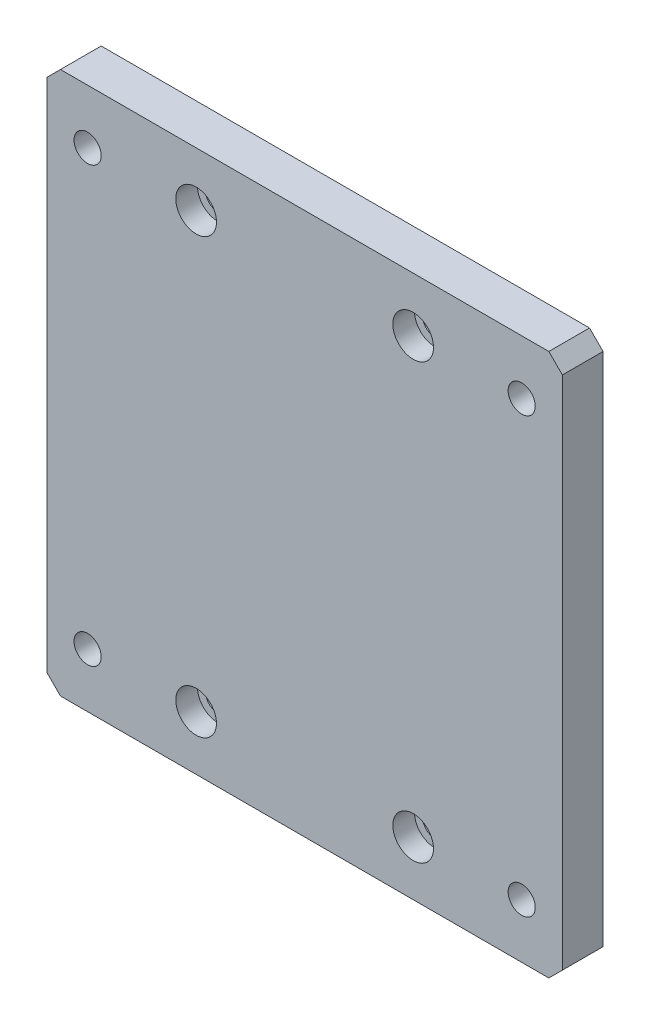
ISO-10303-21;
HEADER;
FILE_DESCRIPTION(('STEP AP214'),'2;1');
FILE_NAME('part.step','',(''),(''),'','','');
FILE_SCHEMA(('AUTOMOTIVE_DESIGN { 1 0 10303 214 1 1 1 1 }'));
ENDSEC;
DATA;
#1=APPLICATION_CONTEXT('core data for automotive mechanical design processes');
#2=APPLICATION_PROTOCOL_DEFINITION('international standard','automotive_design',2000,#1);
#3=PRODUCT_CONTEXT('',#1,'mechanical');
#4=PRODUCT('Part','Part','',(#3));
#5=PRODUCT_RELATED_PRODUCT_CATEGORY('part','',(#4));
#6=PRODUCT_DEFINITION_FORMATION('','',#4);
#7=PRODUCT_DEFINITION_CONTEXT('part definition',#1,'design');
#8=PRODUCT_DEFINITION('design','',#6,#7);
#9=PRODUCT_DEFINITION_SHAPE('','',#8);
#10=(LENGTH_UNIT() NAMED_UNIT(*) SI_UNIT(.MILLI.,.METRE.));
#11=(NAMED_UNIT(*) PLANE_ANGLE_UNIT() SI_UNIT($,.RADIAN.));
#12=(NAMED_UNIT(*) SI_UNIT($,.STERADIAN.) SOLID_ANGLE_UNIT());
#13=UNCERTAINTY_MEASURE_WITH_UNIT(LENGTH_MEASURE(1.E-05),#10,'distance_accuracy_value','');
#14=(GEOMETRIC_REPRESENTATION_CONTEXT(3) GLOBAL_UNCERTAINTY_ASSIGNED_CONTEXT((#13)) GLOBAL_UNIT_ASSIGNED_CONTEXT((#10,
#11,#12)) REPRESENTATION_CONTEXT('',''));
#15=CARTESIAN_POINT('',(0.,0.,0.));
#16=DIRECTION('',(0.,0.,1.));
#17=DIRECTION('',(1.,0.,0.));
#18=AXIS2_PLACEMENT_3D('',#15,#16,#17);
#19=CARTESIAN_POINT('',(95.,100.,15.));
#20=DIRECTION('',(-1.,0.,0.));
#21=DIRECTION('',(0.,-1.,0.));
#22=AXIS2_PLACEMENT_3D('',#19,#20,#21);
#23=PLANE('',#22);
#24=DIRECTION('',(0.,1.,0.));
#25=VECTOR('',#24,1.);
#26=CARTESIAN_POINT('',(95.,100.,0.));
#27=LINE('',#26,#25);
#28=CARTESIAN_POINT('',(95.,-95.,0.));
#29=VERTEX_POINT('',#28);
#30=CARTESIAN_POINT('',(95.,95.,0.));
#31=VERTEX_POINT('',#30);
#32=EDGE_CURVE('E127',#29,#31,#27,.T.);
#33=ORIENTED_EDGE('',*,*,#32,.T.);
#34=DIRECTION('',(0.,0.,1.));
#35=VECTOR('',#34,1.);
#36=CARTESIAN_POINT('',(95.,95.,15.));
#37=LINE('',#36,#35);
#38=CARTESIAN_POINT('',(95.,95.,15.));
#39=VERTEX_POINT('',#38);
#40=EDGE_CURVE('E104',#31,#39,#37,.T.);
#41=ORIENTED_EDGE('',*,*,#40,.T.);
#42=DIRECTION('',(0.,1.,0.));
#43=VECTOR('',#42,1.);
#44=CARTESIAN_POINT('',(95.,100.,15.));
#45=LINE('',#44,#43);
#46=CARTESIAN_POINT('',(95.,-95.,15.));
#47=VERTEX_POINT('',#46);
#48=EDGE_CURVE('E137',#47,#39,#45,.T.);
#49=ORIENTED_EDGE('',*,*,#48,.F.);
#50=DIRECTION('',(0.,0.,-1.));
#51=VECTOR('',#50,1.);
#52=CARTESIAN_POINT('',(95.,-95.,15.));
#53=LINE('',#52,#51);
#54=EDGE_CURVE('E109',#47,#29,#53,.T.);
#55=ORIENTED_EDGE('',*,*,#54,.T.);
#56=EDGE_LOOP('',(#33,#41,#49,#55));
#57=FACE_BOUND('',#56,.T.);
#58=ADVANCED_FACE('F32',(#57),#23,.F.);
#59=CARTESIAN_POINT('',(-95.,100.,15.));
#60=DIRECTION('',(0.,-1.,0.));
#61=DIRECTION('',(0.,0.,-1.));
#62=AXIS2_PLACEMENT_3D('',#59,#60,#61);
#63=PLANE('',#62);
#64=DIRECTION('',(-1.,0.,0.));
#65=VECTOR('',#64,1.);
#66=CARTESIAN_POINT('',(-95.,100.,15.));
#67=LINE('',#66,#65);
#68=CARTESIAN_POINT('',(90.,100.,15.));
#69=VERTEX_POINT('',#68);
#70=CARTESIAN_POINT('',(-90.,100.,15.));
#71=VERTEX_POINT('',#70);
#72=EDGE_CURVE('E119',#69,#71,#67,.T.);
#73=ORIENTED_EDGE('',*,*,#72,.F.);
#74=DIRECTION('',(0.,0.,-1.));
#75=VECTOR('',#74,1.);
#76=CARTESIAN_POINT('',(90.,100.,15.));
#77=LINE('',#76,#75);
#78=CARTESIAN_POINT('',(90.,100.,0.));
#79=VERTEX_POINT('',#78);
#80=EDGE_CURVE('E103',#69,#79,#77,.T.);
#81=ORIENTED_EDGE('',*,*,#80,.T.);
#82=DIRECTION('',(-1.,0.,0.));
#83=VECTOR('',#82,1.);
#84=CARTESIAN_POINT('',(-95.,100.,0.));
#85=LINE('',#84,#83);
#86=CARTESIAN_POINT('',(-90.,100.,0.));
#87=VERTEX_POINT('',#86);
#88=EDGE_CURVE('E116',#79,#87,#85,.T.);
#89=ORIENTED_EDGE('',*,*,#88,.T.);
#90=DIRECTION('',(0.,0.,1.));
#91=VECTOR('',#90,1.);
#92=CARTESIAN_POINT('',(-90.,100.,15.));
#93=LINE('',#92,#91);
#94=EDGE_CURVE('E121',#87,#71,#93,.T.);
#95=ORIENTED_EDGE('',*,*,#94,.T.);
#96=EDGE_LOOP('',(#73,#81,#89,#95));
#97=FACE_BOUND('',#96,.T.);
#98=ADVANCED_FACE('F115',(#97),#63,.F.);
#99=CARTESIAN_POINT('',(-95.,100.,15.));
#100=DIRECTION('',(1.,0.,0.));
#101=DIRECTION('',(0.,1.,0.));
#102=AXIS2_PLACEMENT_3D('',#99,#100,#101);
#103=PLANE('',#102);
#104=DIRECTION('',(0.,-1.,0.));
#105=VECTOR('',#104,1.);
#106=CARTESIAN_POINT('',(-95.,100.,15.));
#107=LINE('',#106,#105);
#108=CARTESIAN_POINT('',(-95.,95.,15.));
#109=VERTEX_POINT('',#108);
#110=CARTESIAN_POINT('',(-95.,-95.,15.));
#111=VERTEX_POINT('',#110);
#112=EDGE_CURVE('E160',#109,#111,#107,.T.);
#113=ORIENTED_EDGE('',*,*,#112,.F.);
#114=DIRECTION('',(0.,0.,-1.));
#115=VECTOR('',#114,1.);
#116=CARTESIAN_POINT('',(-95.,95.,15.));
#117=LINE('',#116,#115);
#118=CARTESIAN_POINT('',(-95.,95.,0.));
#119=VERTEX_POINT('',#118);
#120=EDGE_CURVE('E11',#109,#119,#117,.T.);
#121=ORIENTED_EDGE('',*,*,#120,.T.);
#122=DIRECTION('',(0.,-1.,0.));
#123=VECTOR('',#122,1.);
#124=CARTESIAN_POINT('',(-95.,100.,0.));
#125=LINE('',#124,#123);
#126=CARTESIAN_POINT('',(-95.,-95.,0.));
#127=VERTEX_POINT('',#126);
#128=EDGE_CURVE('E126',#119,#127,#125,.T.);
#129=ORIENTED_EDGE('',*,*,#128,.T.);
#130=DIRECTION('',(0.,0.,1.));
#131=VECTOR('',#130,1.);
#132=CARTESIAN_POINT('',(-95.,-95.,15.));
#133=LINE('',#132,#131);
#134=EDGE_CURVE('E40',#127,#111,#133,.T.);
#135=ORIENTED_EDGE('',*,*,#134,.T.);
#136=EDGE_LOOP('',(#113,#121,#129,#135));
#137=FACE_BOUND('',#136,.T.);
#138=ADVANCED_FACE('F159',(#137),#103,.F.);
#139=CARTESIAN_POINT('',(-95.,-100.,15.));
#140=DIRECTION('',(0.,1.,0.));
#141=DIRECTION('',(0.,0.,1.));
#142=AXIS2_PLACEMENT_3D('',#139,#140,#141);
#143=PLANE('',#142);
#144=DIRECTION('',(1.,0.,0.));
#145=VECTOR('',#144,1.);
#146=CARTESIAN_POINT('',(-95.,-100.,0.));
#147=LINE('',#146,#145);
#148=CARTESIAN_POINT('',(-90.,-100.,0.));
#149=VERTEX_POINT('',#148);
#150=CARTESIAN_POINT('',(90.,-100.,0.));
#151=VERTEX_POINT('',#150);
#152=EDGE_CURVE('E130',#149,#151,#147,.T.);
#153=ORIENTED_EDGE('',*,*,#152,.T.);
#154=DIRECTION('',(0.,0.,1.));
#155=VECTOR('',#154,1.);
#156=CARTESIAN_POINT('',(90.,-100.,15.));
#157=LINE('',#156,#155);
#158=CARTESIAN_POINT('',(90.,-100.,15.));
#159=VERTEX_POINT('',#158);
#160=EDGE_CURVE('E47',#151,#159,#157,.T.);
#161=ORIENTED_EDGE('',*,*,#160,.T.);
#162=DIRECTION('',(1.,0.,0.));
#163=VECTOR('',#162,1.);
#164=CARTESIAN_POINT('',(-95.,-100.,15.));
#165=LINE('',#164,#163);
#166=CARTESIAN_POINT('',(-90.,-100.,15.));
#167=VERTEX_POINT('',#166);
#168=EDGE_CURVE('E138',#167,#159,#165,.T.);
#169=ORIENTED_EDGE('',*,*,#168,.F.);
#170=DIRECTION('',(0.,0.,-1.));
#171=VECTOR('',#170,1.);
#172=CARTESIAN_POINT('',(-90.,-100.,15.));
#173=LINE('',#172,#171);
#174=EDGE_CURVE('E153',#167,#149,#173,.T.);
#175=ORIENTED_EDGE('',*,*,#174,.T.);
#176=EDGE_LOOP('',(#153,#161,#169,#175));
#177=FACE_BOUND('',#176,.T.);
#178=ADVANCED_FACE('F169',(#177),#143,.F.);
#179=CARTESIAN_POINT('',(0.,0.,15.));
#180=DIRECTION('',(0.,0.,1.));
#181=DIRECTION('',(1.,0.,0.));
#182=AXIS2_PLACEMENT_3D('',#179,#180,#181);
#183=PLANE('',#182);
#184=CARTESIAN_POINT('',(40.,80.,15.));
#185=DIRECTION('',(0.,0.,1.));
#186=DIRECTION('',(1.,0.,0.));
#187=AXIS2_PLACEMENT_3D('',#184,#185,#186);
#188=CIRCLE('',#187,7.5);
#189=CARTESIAN_POINT('',(47.5,80.,15.));
#190=VERTEX_POINT('',#189);
#191=EDGE_CURVE('E247',#190,#190,#188,.T.);
#192=ORIENTED_EDGE('',*,*,#191,.F.);
#193=EDGE_LOOP('',(#192));
#194=FACE_BOUND('',#193,.T.);
#195=CARTESIAN_POINT('',(-40.,80.,15.));
#196=DIRECTION('',(0.,0.,1.));
#197=DIRECTION('',(1.,0.,0.));
#198=AXIS2_PLACEMENT_3D('',#195,#196,#197);
#199=CIRCLE('',#198,7.5);
#200=CARTESIAN_POINT('',(-32.5,80.,15.));
#201=VERTEX_POINT('',#200);
#202=EDGE_CURVE('E235',#201,#201,#199,.T.);
#203=ORIENTED_EDGE('',*,*,#202,.F.);
#204=EDGE_LOOP('',(#203));
#205=FACE_BOUND('',#204,.T.);
#206=CARTESIAN_POINT('',(-40.,-80.,15.));
#207=DIRECTION('',(0.,0.,1.));
#208=DIRECTION('',(1.,0.,0.));
#209=AXIS2_PLACEMENT_3D('',#206,#207,#208);
#210=CIRCLE('',#209,7.5);
#211=CARTESIAN_POINT('',(-32.5,-80.,15.));
#212=VERTEX_POINT('',#211);
#213=EDGE_CURVE('E223',#212,#212,#210,.T.);
#214=ORIENTED_EDGE('',*,*,#213,.F.);
#215=EDGE_LOOP('',(#214));
#216=FACE_BOUND('',#215,.T.);
#217=CARTESIAN_POINT('',(40.,-80.,15.));
#218=DIRECTION('',(0.,0.,1.));
#219=DIRECTION('',(1.,0.,0.));
#220=AXIS2_PLACEMENT_3D('',#217,#218,#219);
#221=CIRCLE('',#220,7.5);
#222=CARTESIAN_POINT('',(47.5,-80.,15.));
#223=VERTEX_POINT('',#222);
#224=EDGE_CURVE('E211',#223,#223,#221,.T.);
#225=ORIENTED_EDGE('',*,*,#224,.F.);
#226=EDGE_LOOP('',(#225));
#227=FACE_BOUND('',#226,.T.);
#228=CARTESIAN_POINT('',(-80.,-80.,15.));
#229=DIRECTION('',(0.,0.,1.));
#230=DIRECTION('',(1.,0.,0.));
#231=AXIS2_PLACEMENT_3D('',#228,#229,#230);
#232=CIRCLE('',#231,5.00000000000001);
#233=CARTESIAN_POINT('',(-75.,-80.,15.));
#234=VERTEX_POINT('',#233);
#235=EDGE_CURVE('E185',#234,#234,#232,.T.);
#236=ORIENTED_EDGE('',*,*,#235,.F.);
#237=EDGE_LOOP('',(#236));
#238=FACE_BOUND('',#237,.T.);
#239=CARTESIAN_POINT('',(80.,-80.,15.));
#240=DIRECTION('',(0.,0.,1.));
#241=DIRECTION('',(1.,0.,0.));
#242=AXIS2_PLACEMENT_3D('',#239,#240,#241);
#243=CIRCLE('',#242,5.00000000000001);
#244=CARTESIAN_POINT('',(85.,-80.,15.));
#245=VERTEX_POINT('',#244);
#246=EDGE_CURVE('E192',#245,#245,#243,.T.);
#247=ORIENTED_EDGE('',*,*,#246,.F.);
#248=EDGE_LOOP('',(#247));
#249=FACE_BOUND('',#248,.T.);
#250=CARTESIAN_POINT('',(80.,80.,15.));
#251=DIRECTION('',(0.,0.,1.));
#252=DIRECTION('',(1.,0.,0.));
#253=AXIS2_PLACEMENT_3D('',#250,#251,#252);
#254=CIRCLE('',#253,5.00000000000001);
#255=CARTESIAN_POINT('',(85.,80.,15.));
#256=VERTEX_POINT('',#255);
#257=EDGE_CURVE('E198',#256,#256,#254,.T.);
#258=ORIENTED_EDGE('',*,*,#257,.F.);
#259=EDGE_LOOP('',(#258));
#260=FACE_BOUND('',#259,.T.);
#261=CARTESIAN_POINT('',(-80.,80.,15.));
#262=DIRECTION('',(0.,0.,1.));
#263=DIRECTION('',(1.,0.,0.));
#264=AXIS2_PLACEMENT_3D('',#261,#262,#263);
#265=CIRCLE('',#264,5.00000000000001);
#266=CARTESIAN_POINT('',(-75.,80.,15.));
#267=VERTEX_POINT('',#266);
#268=EDGE_CURVE('E179',#267,#267,#265,.T.);
#269=ORIENTED_EDGE('',*,*,#268,.F.);
#270=EDGE_LOOP('',(#269));
#271=FACE_BOUND('',#270,.T.);
#272=ORIENTED_EDGE('',*,*,#48,.T.);
#273=DIRECTION('',(0.707106781186548,-0.707106781186548,0.));
#274=VECTOR('',#273,1.);
#275=CARTESIAN_POINT('',(95.,95.,15.));
#276=LINE('',#275,#274);
#277=EDGE_CURVE('E151',#39,#69,#276,.F.);
#278=ORIENTED_EDGE('',*,*,#277,.T.);
#279=ORIENTED_EDGE('',*,*,#72,.T.);
#280=DIRECTION('',(0.707106781186548,0.707106781186548,0.));
#281=VECTOR('',#280,1.);
#282=CARTESIAN_POINT('',(-95.,95.,15.));
#283=LINE('',#282,#281);
#284=EDGE_CURVE('E147',#71,#109,#283,.F.);
#285=ORIENTED_EDGE('',*,*,#284,.T.);
#286=ORIENTED_EDGE('',*,*,#112,.T.);
#287=DIRECTION('',(-0.707106781186546,0.707106781186549,0.));
#288=VECTOR('',#287,1.);
#289=CARTESIAN_POINT('',(-95.0000000000002,-94.9999999999997,15.));
#290=LINE('',#289,#288);
#291=EDGE_CURVE('E54',#111,#167,#290,.F.);
#292=ORIENTED_EDGE('',*,*,#291,.T.);
#293=ORIENTED_EDGE('',*,*,#168,.T.);
#294=DIRECTION('',(-0.707106781186549,-0.707106781186546,0.));
#295=VECTOR('',#294,1.);
#296=CARTESIAN_POINT('',(94.9999999999997,-95.0000000000003,15.));
#297=LINE('',#296,#295);
#298=EDGE_CURVE('E149',#159,#47,#297,.F.);
#299=ORIENTED_EDGE('',*,*,#298,.T.);
#300=EDGE_LOOP('',(#272,#278,#279,#285,#286,#292,#293,#299));
#301=FACE_BOUND('',#300,.T.);
#302=ADVANCED_FACE('F164',(#194,#205,#216,#227,#238,#249,#260,#271,#301),#183,.T.);
#303=CARTESIAN_POINT('',(0.,0.,0.));
#304=DIRECTION('',(0.,0.,1.));
#305=DIRECTION('',(1.,0.,0.));
#306=AXIS2_PLACEMENT_3D('',#303,#304,#305);
#307=PLANE('',#306);
#308=CARTESIAN_POINT('',(40.,80.,0.));
#309=DIRECTION('',(0.,0.,1.));
#310=DIRECTION('',(1.,0.,0.));
#311=AXIS2_PLACEMENT_3D('',#308,#309,#310);
#312=CIRCLE('',#311,4.5);
#313=CARTESIAN_POINT('',(44.5,80.,0.));
#314=VERTEX_POINT('',#313);
#315=EDGE_CURVE('E238',#314,#314,#312,.T.);
#316=ORIENTED_EDGE('',*,*,#315,.T.);
#317=EDGE_LOOP('',(#316));
#318=FACE_BOUND('',#317,.T.);
#319=CARTESIAN_POINT('',(-40.,80.,0.));
#320=DIRECTION('',(0.,0.,1.));
#321=DIRECTION('',(1.,0.,0.));
#322=AXIS2_PLACEMENT_3D('',#319,#320,#321);
#323=CIRCLE('',#322,4.5);
#324=CARTESIAN_POINT('',(-35.5,80.,0.));
#325=VERTEX_POINT('',#324);
#326=EDGE_CURVE('E226',#325,#325,#323,.T.);
#327=ORIENTED_EDGE('',*,*,#326,.T.);
#328=EDGE_LOOP('',(#327));
#329=FACE_BOUND('',#328,.T.);
#330=CARTESIAN_POINT('',(-40.,-80.,0.));
#331=DIRECTION('',(0.,0.,1.));
#332=DIRECTION('',(1.,0.,0.));
#333=AXIS2_PLACEMENT_3D('',#330,#331,#332);
#334=CIRCLE('',#333,4.5);
#335=CARTESIAN_POINT('',(-35.5,-80.,0.));
#336=VERTEX_POINT('',#335);
#337=EDGE_CURVE('E214',#336,#336,#334,.T.);
#338=ORIENTED_EDGE('',*,*,#337,.T.);
#339=EDGE_LOOP('',(#338));
#340=FACE_BOUND('',#339,.T.);
#341=CARTESIAN_POINT('',(40.,-80.,0.));
#342=DIRECTION('',(0.,0.,1.));
#343=DIRECTION('',(1.,0.,0.));
#344=AXIS2_PLACEMENT_3D('',#341,#342,#343);
#345=CIRCLE('',#344,4.5);
#346=CARTESIAN_POINT('',(44.5,-80.,0.));
#347=VERTEX_POINT('',#346);
#348=EDGE_CURVE('E189',#347,#347,#345,.T.);
#349=ORIENTED_EDGE('',*,*,#348,.T.);
#350=EDGE_LOOP('',(#349));
#351=FACE_BOUND('',#350,.T.);
#352=CARTESIAN_POINT('',(-80.,-80.,0.));
#353=DIRECTION('',(0.,0.,1.));
#354=DIRECTION('',(1.,0.,0.));
#355=AXIS2_PLACEMENT_3D('',#352,#353,#354);
#356=CIRCLE('',#355,5.00000000000001);
#357=CARTESIAN_POINT('',(-75.,-80.,0.));
#358=VERTEX_POINT('',#357);
#359=EDGE_CURVE('E188',#358,#358,#356,.T.);
#360=ORIENTED_EDGE('',*,*,#359,.T.);
#361=EDGE_LOOP('',(#360));
#362=FACE_BOUND('',#361,.T.);
#363=CARTESIAN_POINT('',(80.,-80.,0.));
#364=DIRECTION('',(0.,0.,1.));
#365=DIRECTION('',(1.,0.,0.));
#366=AXIS2_PLACEMENT_3D('',#363,#364,#365);
#367=CIRCLE('',#366,5.00000000000001);
#368=CARTESIAN_POINT('',(85.,-80.,0.));
#369=VERTEX_POINT('',#368);
#370=EDGE_CURVE('E195',#369,#369,#367,.T.);
#371=ORIENTED_EDGE('',*,*,#370,.T.);
#372=EDGE_LOOP('',(#371));
#373=FACE_BOUND('',#372,.T.);
#374=CARTESIAN_POINT('',(80.,80.,0.));
#375=DIRECTION('',(0.,0.,1.));
#376=DIRECTION('',(1.,0.,0.));
#377=AXIS2_PLACEMENT_3D('',#374,#375,#376);
#378=CIRCLE('',#377,5.00000000000001);
#379=CARTESIAN_POINT('',(85.,80.,0.));
#380=VERTEX_POINT('',#379);
#381=EDGE_CURVE('E182',#380,#380,#378,.T.);
#382=ORIENTED_EDGE('',*,*,#381,.T.);
#383=EDGE_LOOP('',(#382));
#384=FACE_BOUND('',#383,.T.);
#385=CARTESIAN_POINT('',(-80.,80.,0.));
#386=DIRECTION('',(0.,0.,1.));
#387=DIRECTION('',(1.,0.,0.));
#388=AXIS2_PLACEMENT_3D('',#385,#386,#387);
#389=CIRCLE('',#388,5.00000000000001);
#390=CARTESIAN_POINT('',(-75.,80.,0.));
#391=VERTEX_POINT('',#390);
#392=EDGE_CURVE('E132',#391,#391,#389,.T.);
#393=ORIENTED_EDGE('',*,*,#392,.T.);
#394=EDGE_LOOP('',(#393));
#395=FACE_BOUND('',#394,.T.);
#396=ORIENTED_EDGE('',*,*,#88,.F.);
#397=DIRECTION('',(-0.707106781186548,0.707106781186548,0.));
#398=VECTOR('',#397,1.);
#399=CARTESIAN_POINT('',(90.,100.,0.));
#400=LINE('',#399,#398);
#401=EDGE_CURVE('E99',#79,#31,#400,.F.);
#402=ORIENTED_EDGE('',*,*,#401,.T.);
#403=ORIENTED_EDGE('',*,*,#32,.F.);
#404=DIRECTION('',(0.707106781186549,0.707106781186546,0.));
#405=VECTOR('',#404,1.);
#406=CARTESIAN_POINT('',(95.,-95.,0.));
#407=LINE('',#406,#405);
#408=EDGE_CURVE('E110',#29,#151,#407,.F.);
#409=ORIENTED_EDGE('',*,*,#408,.T.);
#410=ORIENTED_EDGE('',*,*,#152,.F.);
#411=DIRECTION('',(0.707106781186546,-0.707106781186549,0.));
#412=VECTOR('',#411,1.);
#413=CARTESIAN_POINT('',(-90.,-100.,0.));
#414=LINE('',#413,#412);
#415=EDGE_CURVE('E120',#149,#127,#414,.F.);
#416=ORIENTED_EDGE('',*,*,#415,.T.);
#417=ORIENTED_EDGE('',*,*,#128,.F.);
#418=DIRECTION('',(-0.707106781186548,-0.707106781186548,0.));
#419=VECTOR('',#418,1.);
#420=CARTESIAN_POINT('',(-95.,95.,0.));
#421=LINE('',#420,#419);
#422=EDGE_CURVE('E125',#119,#87,#421,.F.);
#423=ORIENTED_EDGE('',*,*,#422,.T.);
#424=EDGE_LOOP('',(#396,#402,#403,#409,#410,#416,#417,#423));
#425=FACE_BOUND('',#424,.T.);
#426=ADVANCED_FACE('F123',(#318,#329,#340,#351,#362,#373,#384,#395,#425),#307,.F.);
#427=CARTESIAN_POINT('',(-80.,80.,0.));
#428=DIRECTION('',(0.,0.,1.));
#429=DIRECTION('',(1.,0.,0.));
#430=AXIS2_PLACEMENT_3D('',#427,#428,#429);
#431=CYLINDRICAL_SURFACE('',#430,5.00000000000001);
#432=ORIENTED_EDGE('',*,*,#392,.F.);
#433=EDGE_LOOP('',(#432));
#434=FACE_BOUND('',#433,.T.);
#435=ORIENTED_EDGE('',*,*,#268,.T.);
#436=EDGE_LOOP('',(#435));
#437=FACE_BOUND('',#436,.T.);
#438=ADVANCED_FACE('F270',(#434,#437),#431,.F.);
#439=CARTESIAN_POINT('',(80.,80.,0.));
#440=DIRECTION('',(0.,0.,1.));
#441=DIRECTION('',(1.,0.,0.));
#442=AXIS2_PLACEMENT_3D('',#439,#440,#441);
#443=CYLINDRICAL_SURFACE('',#442,5.00000000000001);
#444=ORIENTED_EDGE('',*,*,#381,.F.);
#445=EDGE_LOOP('',(#444));
#446=FACE_BOUND('',#445,.T.);
#447=ORIENTED_EDGE('',*,*,#257,.T.);
#448=EDGE_LOOP('',(#447));
#449=FACE_BOUND('',#448,.T.);
#450=ADVANCED_FACE('F272',(#446,#449),#443,.F.);
#451=CARTESIAN_POINT('',(80.,-80.,0.));
#452=DIRECTION('',(0.,0.,1.));
#453=DIRECTION('',(1.,0.,0.));
#454=AXIS2_PLACEMENT_3D('',#451,#452,#453);
#455=CYLINDRICAL_SURFACE('',#454,5.00000000000001);
#456=ORIENTED_EDGE('',*,*,#370,.F.);
#457=EDGE_LOOP('',(#456));
#458=FACE_BOUND('',#457,.T.);
#459=ORIENTED_EDGE('',*,*,#246,.T.);
#460=EDGE_LOOP('',(#459));
#461=FACE_BOUND('',#460,.T.);
#462=ADVANCED_FACE('F279',(#458,#461),#455,.F.);
#463=CARTESIAN_POINT('',(-80.,-80.,0.));
#464=DIRECTION('',(0.,0.,1.));
#465=DIRECTION('',(1.,0.,0.));
#466=AXIS2_PLACEMENT_3D('',#463,#464,#465);
#467=CYLINDRICAL_SURFACE('',#466,5.00000000000001);
#468=ORIENTED_EDGE('',*,*,#359,.F.);
#469=EDGE_LOOP('',(#468));
#470=FACE_BOUND('',#469,.T.);
#471=ORIENTED_EDGE('',*,*,#235,.T.);
#472=EDGE_LOOP('',(#471));
#473=FACE_BOUND('',#472,.T.);
#474=ADVANCED_FACE('F296',(#470,#473),#467,.F.);
#475=CARTESIAN_POINT('',(90.,100.,15.));
#476=DIRECTION('',(-0.707106781186547,-0.707106781186547,0.));
#477=DIRECTION('',(0.,0.,-1.));
#478=AXIS2_PLACEMENT_3D('',#475,#476,#477);
#479=PLANE('',#478);
#480=ORIENTED_EDGE('',*,*,#277,.F.);
#481=ORIENTED_EDGE('',*,*,#40,.F.);
#482=ORIENTED_EDGE('',*,*,#401,.F.);
#483=ORIENTED_EDGE('',*,*,#80,.F.);
#484=EDGE_LOOP('',(#480,#481,#482,#483));
#485=FACE_BOUND('',#484,.T.);
#486=ADVANCED_FACE('F102',(#485),#479,.F.);
#487=CARTESIAN_POINT('',(95.,-95.,15.));
#488=DIRECTION('',(-0.707106781186546,0.707106781186549,0.));
#489=DIRECTION('',(0.,0.,-1.));
#490=AXIS2_PLACEMENT_3D('',#487,#488,#489);
#491=PLANE('',#490);
#492=ORIENTED_EDGE('',*,*,#298,.F.);
#493=ORIENTED_EDGE('',*,*,#160,.F.);
#494=ORIENTED_EDGE('',*,*,#408,.F.);
#495=ORIENTED_EDGE('',*,*,#54,.F.);
#496=EDGE_LOOP('',(#492,#493,#494,#495));
#497=FACE_BOUND('',#496,.T.);
#498=ADVANCED_FACE('F173',(#497),#491,.F.);
#499=CARTESIAN_POINT('',(-95.,95.,15.));
#500=DIRECTION('',(0.707106781186547,-0.707106781186547,0.));
#501=DIRECTION('',(0.,0.,-1.));
#502=AXIS2_PLACEMENT_3D('',#499,#500,#501);
#503=PLANE('',#502);
#504=ORIENTED_EDGE('',*,*,#284,.F.);
#505=ORIENTED_EDGE('',*,*,#94,.F.);
#506=ORIENTED_EDGE('',*,*,#422,.F.);
#507=ORIENTED_EDGE('',*,*,#120,.F.);
#508=EDGE_LOOP('',(#504,#505,#506,#507));
#509=FACE_BOUND('',#508,.T.);
#510=ADVANCED_FACE('F298',(#509),#503,.F.);
#511=CARTESIAN_POINT('',(-90.,-100.,15.));
#512=DIRECTION('',(0.707106781186549,0.707106781186546,0.));
#513=DIRECTION('',(0.,0.,-1.));
#514=AXIS2_PLACEMENT_3D('',#511,#512,#513);
#515=PLANE('',#514);
#516=ORIENTED_EDGE('',*,*,#291,.F.);
#517=ORIENTED_EDGE('',*,*,#134,.F.);
#518=ORIENTED_EDGE('',*,*,#415,.F.);
#519=ORIENTED_EDGE('',*,*,#174,.F.);
#520=EDGE_LOOP('',(#516,#517,#518,#519));
#521=FACE_BOUND('',#520,.T.);
#522=ADVANCED_FACE('F34',(#521),#515,.F.);
#523=CARTESIAN_POINT('',(40.,-80.,15.));
#524=DIRECTION('',(0.,0.,1.));
#525=DIRECTION('',(1.,0.,0.));
#526=AXIS2_PLACEMENT_3D('',#523,#524,#525);
#527=CYLINDRICAL_SURFACE('',#526,4.5);
#528=ORIENTED_EDGE('',*,*,#348,.F.);
#529=EDGE_LOOP('',(#528));
#530=FACE_BOUND('',#529,.T.);
#531=CARTESIAN_POINT('',(40.,-80.,7.));
#532=DIRECTION('',(0.,0.,1.));
#533=DIRECTION('',(1.,0.,0.));
#534=AXIS2_PLACEMENT_3D('',#531,#532,#533);
#535=CIRCLE('',#534,4.5);
#536=CARTESIAN_POINT('',(44.5,-80.,7.));
#537=VERTEX_POINT('',#536);
#538=EDGE_CURVE('E205',#537,#537,#535,.T.);
#539=ORIENTED_EDGE('',*,*,#538,.T.);
#540=EDGE_LOOP('',(#539));
#541=FACE_BOUND('',#540,.T.);
#542=ADVANCED_FACE('F304',(#530,#541),#527,.F.);
#543=CARTESIAN_POINT('',(44.5,-80.,7.));
#544=DIRECTION('',(0.,0.,-1.));
#545=DIRECTION('',(-1.,0.,0.));
#546=AXIS2_PLACEMENT_3D('',#543,#544,#545);
#547=PLANE('',#546);
#548=ORIENTED_EDGE('',*,*,#538,.F.);
#549=EDGE_LOOP('',(#548));
#550=FACE_BOUND('',#549,.T.);
#551=CARTESIAN_POINT('',(40.,-80.,7.));
#552=DIRECTION('',(0.,0.,1.));
#553=DIRECTION('',(1.,0.,0.));
#554=AXIS2_PLACEMENT_3D('',#551,#552,#553);
#555=CIRCLE('',#554,7.5);
#556=CARTESIAN_POINT('',(47.5,-80.,7.));
#557=VERTEX_POINT('',#556);
#558=EDGE_CURVE('E208',#557,#557,#555,.T.);
#559=ORIENTED_EDGE('',*,*,#558,.T.);
#560=EDGE_LOOP('',(#559));
#561=FACE_BOUND('',#560,.T.);
#562=ADVANCED_FACE('F308',(#550,#561),#547,.F.);
#563=CARTESIAN_POINT('',(40.,-80.,15.));
#564=DIRECTION('',(0.,0.,1.));
#565=DIRECTION('',(1.,0.,0.));
#566=AXIS2_PLACEMENT_3D('',#563,#564,#565);
#567=CYLINDRICAL_SURFACE('',#566,7.5);
#568=ORIENTED_EDGE('',*,*,#558,.F.);
#569=EDGE_LOOP('',(#568));
#570=FACE_BOUND('',#569,.T.);
#571=ORIENTED_EDGE('',*,*,#224,.T.);
#572=EDGE_LOOP('',(#571));
#573=FACE_BOUND('',#572,.T.);
#574=ADVANCED_FACE('F314',(#570,#573),#567,.F.);
#575=CARTESIAN_POINT('',(-40.,-80.,15.));
#576=DIRECTION('',(0.,0.,1.));
#577=DIRECTION('',(1.,0.,0.));
#578=AXIS2_PLACEMENT_3D('',#575,#576,#577);
#579=CYLINDRICAL_SURFACE('',#578,4.5);
#580=ORIENTED_EDGE('',*,*,#337,.F.);
#581=EDGE_LOOP('',(#580));
#582=FACE_BOUND('',#581,.T.);
#583=CARTESIAN_POINT('',(-40.,-80.,7.));
#584=DIRECTION('',(0.,0.,1.));
#585=DIRECTION('',(1.,0.,0.));
#586=AXIS2_PLACEMENT_3D('',#583,#584,#585);
#587=CIRCLE('',#586,4.5);
#588=CARTESIAN_POINT('',(-35.5,-80.,7.));
#589=VERTEX_POINT('',#588);
#590=EDGE_CURVE('E217',#589,#589,#587,.T.);
#591=ORIENTED_EDGE('',*,*,#590,.T.);
#592=EDGE_LOOP('',(#591));
#593=FACE_BOUND('',#592,.T.);
#594=ADVANCED_FACE('F390',(#582,#593),#579,.F.);
#595=CARTESIAN_POINT('',(-35.5,-80.,7.));
#596=DIRECTION('',(0.,0.,-1.));
#597=DIRECTION('',(-1.,0.,0.));
#598=AXIS2_PLACEMENT_3D('',#595,#596,#597);
#599=PLANE('',#598);
#600=ORIENTED_EDGE('',*,*,#590,.F.);
#601=EDGE_LOOP('',(#600));
#602=FACE_BOUND('',#601,.T.);
#603=CARTESIAN_POINT('',(-40.,-80.,7.));
#604=DIRECTION('',(0.,0.,1.));
#605=DIRECTION('',(1.,0.,0.));
#606=AXIS2_PLACEMENT_3D('',#603,#604,#605);
#607=CIRCLE('',#606,7.5);
#608=CARTESIAN_POINT('',(-32.5,-80.,7.));
#609=VERTEX_POINT('',#608);
#610=EDGE_CURVE('E220',#609,#609,#607,.T.);
#611=ORIENTED_EDGE('',*,*,#610,.T.);
#612=EDGE_LOOP('',(#611));
#613=FACE_BOUND('',#612,.T.);
#614=ADVANCED_FACE('F399',(#602,#613),#599,.F.);
#615=CARTESIAN_POINT('',(-40.,-80.,15.));
#616=DIRECTION('',(0.,0.,1.));
#617=DIRECTION('',(1.,0.,0.));
#618=AXIS2_PLACEMENT_3D('',#615,#616,#617);
#619=CYLINDRICAL_SURFACE('',#618,7.5);
#620=ORIENTED_EDGE('',*,*,#610,.F.);
#621=EDGE_LOOP('',(#620));
#622=FACE_BOUND('',#621,.T.);
#623=ORIENTED_EDGE('',*,*,#213,.T.);
#624=EDGE_LOOP('',(#623));
#625=FACE_BOUND('',#624,.T.);
#626=ADVANCED_FACE('F409',(#622,#625),#619,.F.);
#627=CARTESIAN_POINT('',(-40.,80.,15.));
#628=DIRECTION('',(0.,0.,1.));
#629=DIRECTION('',(1.,0.,0.));
#630=AXIS2_PLACEMENT_3D('',#627,#628,#629);
#631=CYLINDRICAL_SURFACE('',#630,4.5);
#632=ORIENTED_EDGE('',*,*,#326,.F.);
#633=EDGE_LOOP('',(#632));
#634=FACE_BOUND('',#633,.T.);
#635=CARTESIAN_POINT('',(-40.,80.,7.));
#636=DIRECTION('',(0.,0.,1.));
#637=DIRECTION('',(1.,0.,0.));
#638=AXIS2_PLACEMENT_3D('',#635,#636,#637);
#639=CIRCLE('',#638,4.5);
#640=CARTESIAN_POINT('',(-35.5,80.,7.));
#641=VERTEX_POINT('',#640);
#642=EDGE_CURVE('E229',#641,#641,#639,.T.);
#643=ORIENTED_EDGE('',*,*,#642,.T.);
#644=EDGE_LOOP('',(#643));
#645=FACE_BOUND('',#644,.T.);
#646=ADVANCED_FACE('F419',(#634,#645),#631,.F.);
#647=CARTESIAN_POINT('',(-35.5,80.,7.));
#648=DIRECTION('',(0.,0.,-1.));
#649=DIRECTION('',(-1.,0.,0.));
#650=AXIS2_PLACEMENT_3D('',#647,#648,#649);
#651=PLANE('',#650);
#652=ORIENTED_EDGE('',*,*,#642,.F.);
#653=EDGE_LOOP('',(#652));
#654=FACE_BOUND('',#653,.T.);
#655=CARTESIAN_POINT('',(-40.,80.,7.));
#656=DIRECTION('',(0.,0.,1.));
#657=DIRECTION('',(1.,0.,0.));
#658=AXIS2_PLACEMENT_3D('',#655,#656,#657);
#659=CIRCLE('',#658,7.5);
#660=CARTESIAN_POINT('',(-32.5,80.,7.));
#661=VERTEX_POINT('',#660);
#662=EDGE_CURVE('E232',#661,#661,#659,.T.);
#663=ORIENTED_EDGE('',*,*,#662,.T.);
#664=EDGE_LOOP('',(#663));
#665=FACE_BOUND('',#664,.T.);
#666=ADVANCED_FACE('F429',(#654,#665),#651,.F.);
#667=CARTESIAN_POINT('',(-40.,80.,15.));
#668=DIRECTION('',(0.,0.,1.));
#669=DIRECTION('',(1.,0.,0.));
#670=AXIS2_PLACEMENT_3D('',#667,#668,#669);
#671=CYLINDRICAL_SURFACE('',#670,7.5);
#672=ORIENTED_EDGE('',*,*,#662,.F.);
#673=EDGE_LOOP('',(#672));
#674=FACE_BOUND('',#673,.T.);
#675=ORIENTED_EDGE('',*,*,#202,.T.);
#676=EDGE_LOOP('',(#675));
#677=FACE_BOUND('',#676,.T.);
#678=ADVANCED_FACE('F439',(#674,#677),#671,.F.);
#679=CARTESIAN_POINT('',(40.,80.,15.));
#680=DIRECTION('',(0.,0.,1.));
#681=DIRECTION('',(1.,0.,0.));
#682=AXIS2_PLACEMENT_3D('',#679,#680,#681);
#683=CYLINDRICAL_SURFACE('',#682,4.5);
#684=ORIENTED_EDGE('',*,*,#315,.F.);
#685=EDGE_LOOP('',(#684));
#686=FACE_BOUND('',#685,.T.);
#687=CARTESIAN_POINT('',(40.,80.,7.));
#688=DIRECTION('',(0.,0.,1.));
#689=DIRECTION('',(1.,0.,0.));
#690=AXIS2_PLACEMENT_3D('',#687,#688,#689);
#691=CIRCLE('',#690,4.5);
#692=CARTESIAN_POINT('',(44.5,80.,7.));
#693=VERTEX_POINT('',#692);
#694=EDGE_CURVE('E241',#693,#693,#691,.T.);
#695=ORIENTED_EDGE('',*,*,#694,.T.);
#696=EDGE_LOOP('',(#695));
#697=FACE_BOUND('',#696,.T.);
#698=ADVANCED_FACE('F449',(#686,#697),#683,.F.);
#699=CARTESIAN_POINT('',(44.5,80.,7.));
#700=DIRECTION('',(0.,0.,-1.));
#701=DIRECTION('',(-1.,0.,0.));
#702=AXIS2_PLACEMENT_3D('',#699,#700,#701);
#703=PLANE('',#702);
#704=ORIENTED_EDGE('',*,*,#694,.F.);
#705=EDGE_LOOP('',(#704));
#706=FACE_BOUND('',#705,.T.);
#707=CARTESIAN_POINT('',(40.,80.,7.));
#708=DIRECTION('',(0.,0.,1.));
#709=DIRECTION('',(1.,0.,0.));
#710=AXIS2_PLACEMENT_3D('',#707,#708,#709);
#711=CIRCLE('',#710,7.5);
#712=CARTESIAN_POINT('',(47.5,80.,7.));
#713=VERTEX_POINT('',#712);
#714=EDGE_CURVE('E244',#713,#713,#711,.T.);
#715=ORIENTED_EDGE('',*,*,#714,.T.);
#716=EDGE_LOOP('',(#715));
#717=FACE_BOUND('',#716,.T.);
#718=ADVANCED_FACE('F459',(#706,#717),#703,.F.);
#719=CARTESIAN_POINT('',(40.,80.,15.));
#720=DIRECTION('',(0.,0.,1.));
#721=DIRECTION('',(1.,0.,0.));
#722=AXIS2_PLACEMENT_3D('',#719,#720,#721);
#723=CYLINDRICAL_SURFACE('',#722,7.5);
#724=ORIENTED_EDGE('',*,*,#714,.F.);
#725=EDGE_LOOP('',(#724));
#726=FACE_BOUND('',#725,.T.);
#727=ORIENTED_EDGE('',*,*,#191,.T.);
#728=EDGE_LOOP('',(#727));
#729=FACE_BOUND('',#728,.T.);
#730=ADVANCED_FACE('F251',(#726,#729),#723,.F.);
#731=CLOSED_SHELL('',(#58,#98,#138,#178,#302,#426,#438,#450,#462,#474,#486,#498,#510,#522,#542,
#562,#574,#594,#614,#626,#646,#666,#678,#698,#718,#730));
#732=MANIFOLD_SOLID_BREP('B2',#731);
#733=ADVANCED_BREP_SHAPE_REPRESENTATION('',(#18,#732),#14);
#734=SHAPE_DEFINITION_REPRESENTATION(#9,#733);
ENDSEC;
END-ISO-10303-21;
